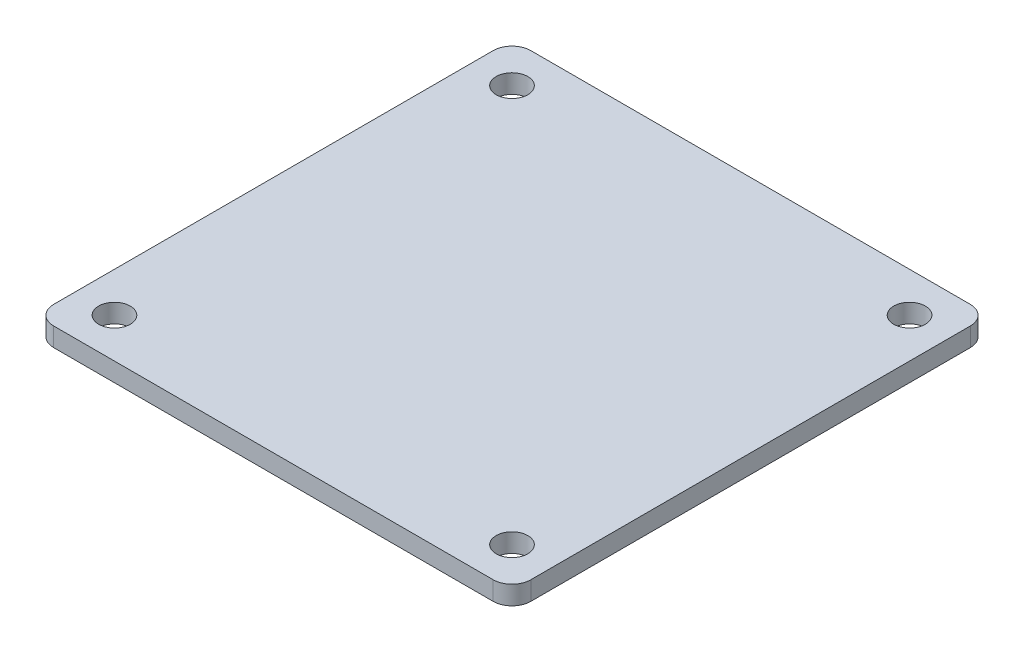
ISO-10303-21;
HEADER;
FILE_DESCRIPTION(('STEP AP214'),'2;1');
FILE_NAME('part.step','',(''),(''),'','','');
FILE_SCHEMA(('AUTOMOTIVE_DESIGN { 1 0 10303 214 1 1 1 1 }'));
ENDSEC;
DATA;
#1=APPLICATION_CONTEXT('core data for automotive mechanical design processes');
#2=APPLICATION_PROTOCOL_DEFINITION('international standard','automotive_design',2000,#1);
#3=PRODUCT_CONTEXT('',#1,'mechanical');
#4=PRODUCT('Part','Part','',(#3));
#5=PRODUCT_RELATED_PRODUCT_CATEGORY('part','',(#4));
#6=PRODUCT_DEFINITION_FORMATION('','',#4);
#7=PRODUCT_DEFINITION_CONTEXT('part definition',#1,'design');
#8=PRODUCT_DEFINITION('design','',#6,#7);
#9=PRODUCT_DEFINITION_SHAPE('','',#8);
#10=(LENGTH_UNIT() NAMED_UNIT(*) SI_UNIT(.MILLI.,.METRE.));
#11=(NAMED_UNIT(*) PLANE_ANGLE_UNIT() SI_UNIT($,.RADIAN.));
#12=(NAMED_UNIT(*) SI_UNIT($,.STERADIAN.) SOLID_ANGLE_UNIT());
#13=UNCERTAINTY_MEASURE_WITH_UNIT(LENGTH_MEASURE(1.E-05),#10,'distance_accuracy_value','');
#14=(GEOMETRIC_REPRESENTATION_CONTEXT(3) GLOBAL_UNCERTAINTY_ASSIGNED_CONTEXT((#13)) GLOBAL_UNIT_ASSIGNED_CONTEXT((#10,
#11,#12)) REPRESENTATION_CONTEXT('',''));
#15=CARTESIAN_POINT('',(0.,0.,0.));
#16=DIRECTION('',(0.,0.,1.));
#17=DIRECTION('',(1.,0.,0.));
#18=AXIS2_PLACEMENT_3D('',#15,#16,#17);
#19=CARTESIAN_POINT('',(0.,3.,0.));
#20=DIRECTION('',(0.,-1.,0.));
#21=DIRECTION('',(0.,0.,-1.));
#22=AXIS2_PLACEMENT_3D('',#19,#20,#21);
#23=PLANE('',#22);
#24=DIRECTION('',(1.,0.,0.));
#25=VECTOR('',#24,1.);
#26=CARTESIAN_POINT('',(-38.1,3.,38.1));
#27=LINE('',#26,#25);
#28=CARTESIAN_POINT('',(-35.1,3.,38.1));
#29=VERTEX_POINT('',#28);
#30=CARTESIAN_POINT('',(35.1,3.,38.1));
#31=VERTEX_POINT('',#30);
#32=EDGE_CURVE('E145',#29,#31,#27,.T.);
#33=ORIENTED_EDGE('',*,*,#32,.T.);
#34=CARTESIAN_POINT('',(35.1,3.,35.1));
#35=DIRECTION('',(0.,-1.,0.));
#36=DIRECTION('',(0.,0.,-1.));
#37=AXIS2_PLACEMENT_3D('',#34,#35,#36);
#38=CIRCLE('',#37,3.);
#39=CARTESIAN_POINT('',(38.1,3.,35.1));
#40=VERTEX_POINT('',#39);
#41=EDGE_CURVE('E164',#31,#40,#38,.F.);
#42=ORIENTED_EDGE('',*,*,#41,.T.);
#43=DIRECTION('',(0.,0.,-1.));
#44=VECTOR('',#43,1.);
#45=CARTESIAN_POINT('',(38.1,3.,38.1));
#46=LINE('',#45,#44);
#47=CARTESIAN_POINT('',(38.1,3.,-35.1));
#48=VERTEX_POINT('',#47);
#49=EDGE_CURVE('E128',#40,#48,#46,.T.);
#50=ORIENTED_EDGE('',*,*,#49,.T.);
#51=CARTESIAN_POINT('',(35.1,3.,-35.1));
#52=DIRECTION('',(0.,-1.,0.));
#53=DIRECTION('',(0.,0.,-1.));
#54=AXIS2_PLACEMENT_3D('',#51,#52,#53);
#55=CIRCLE('',#54,3.);
#56=CARTESIAN_POINT('',(35.1,3.,-38.1));
#57=VERTEX_POINT('',#56);
#58=EDGE_CURVE('E162',#48,#57,#55,.F.);
#59=ORIENTED_EDGE('',*,*,#58,.T.);
#60=DIRECTION('',(-1.,0.,0.));
#61=VECTOR('',#60,1.);
#62=CARTESIAN_POINT('',(-38.1,3.,-38.1));
#63=LINE('',#62,#61);
#64=CARTESIAN_POINT('',(-35.1,3.,-38.1));
#65=VERTEX_POINT('',#64);
#66=EDGE_CURVE('E175',#57,#65,#63,.T.);
#67=ORIENTED_EDGE('',*,*,#66,.T.);
#68=CARTESIAN_POINT('',(-35.1,3.,-35.1));
#69=DIRECTION('',(0.,-1.,0.));
#70=DIRECTION('',(0.,0.,-1.));
#71=AXIS2_PLACEMENT_3D('',#68,#69,#70);
#72=CIRCLE('',#71,3.);
#73=CARTESIAN_POINT('',(-38.1,3.,-35.1));
#74=VERTEX_POINT('',#73);
#75=EDGE_CURVE('E63',#65,#74,#72,.F.);
#76=ORIENTED_EDGE('',*,*,#75,.T.);
#77=DIRECTION('',(0.,0.,1.));
#78=VECTOR('',#77,1.);
#79=CARTESIAN_POINT('',(-38.1,3.,38.1));
#80=LINE('',#79,#78);
#81=CARTESIAN_POINT('',(-38.1,3.,35.1));
#82=VERTEX_POINT('',#81);
#83=EDGE_CURVE('E183',#74,#82,#80,.T.);
#84=ORIENTED_EDGE('',*,*,#83,.T.);
#85=CARTESIAN_POINT('',(-35.1,3.,35.1));
#86=DIRECTION('',(0.,-1.,0.));
#87=DIRECTION('',(0.,0.,-1.));
#88=AXIS2_PLACEMENT_3D('',#85,#86,#87);
#89=CIRCLE('',#88,3.);
#90=EDGE_CURVE('E159',#82,#29,#89,.F.);
#91=ORIENTED_EDGE('',*,*,#90,.T.);
#92=EDGE_LOOP('',(#33,#42,#50,#59,#67,#76,#84,#91));
#93=FACE_BOUND('',#92,.T.);
#94=CARTESIAN_POINT('',(-31.75,3.,-31.75));
#95=DIRECTION('',(0.,1.,0.));
#96=DIRECTION('',(0.,0.,1.));
#97=AXIS2_PLACEMENT_3D('',#94,#95,#96);
#98=CIRCLE('',#97,2.525);
#99=CARTESIAN_POINT('',(-31.75,3.,-29.225));
#100=VERTEX_POINT('',#99);
#101=EDGE_CURVE('E136',#100,#100,#98,.T.);
#102=ORIENTED_EDGE('',*,*,#101,.F.);
#103=EDGE_LOOP('',(#102));
#104=FACE_BOUND('',#103,.T.);
#105=CARTESIAN_POINT('',(31.75,3.,-31.75));
#106=DIRECTION('',(0.,1.,0.));
#107=DIRECTION('',(0.,0.,1.));
#108=AXIS2_PLACEMENT_3D('',#105,#106,#107);
#109=CIRCLE('',#108,2.52500000000001);
#110=CARTESIAN_POINT('',(31.75,3.,-29.225));
#111=VERTEX_POINT('',#110);
#112=EDGE_CURVE('E190',#111,#111,#109,.T.);
#113=ORIENTED_EDGE('',*,*,#112,.F.);
#114=EDGE_LOOP('',(#113));
#115=FACE_BOUND('',#114,.T.);
#116=CARTESIAN_POINT('',(31.75,3.,31.75));
#117=DIRECTION('',(0.,1.,0.));
#118=DIRECTION('',(0.,0.,1.));
#119=AXIS2_PLACEMENT_3D('',#116,#117,#118);
#120=CIRCLE('',#119,2.525);
#121=CARTESIAN_POINT('',(31.75,3.,34.275));
#122=VERTEX_POINT('',#121);
#123=EDGE_CURVE('E195',#122,#122,#120,.T.);
#124=ORIENTED_EDGE('',*,*,#123,.F.);
#125=EDGE_LOOP('',(#124));
#126=FACE_BOUND('',#125,.T.);
#127=CARTESIAN_POINT('',(-31.75,3.,31.75));
#128=DIRECTION('',(0.,1.,0.));
#129=DIRECTION('',(0.,0.,1.));
#130=AXIS2_PLACEMENT_3D('',#127,#128,#129);
#131=CIRCLE('',#130,2.525);
#132=CARTESIAN_POINT('',(-31.75,3.,34.275));
#133=VERTEX_POINT('',#132);
#134=EDGE_CURVE('E201',#133,#133,#131,.T.);
#135=ORIENTED_EDGE('',*,*,#134,.F.);
#136=EDGE_LOOP('',(#135));
#137=FACE_BOUND('',#136,.T.);
#138=ADVANCED_FACE('F42',(#93,#104,#115,#126,#137),#23,.F.);
#139=CARTESIAN_POINT('',(0.,0.,0.));
#140=DIRECTION('',(0.,-1.,0.));
#141=DIRECTION('',(0.,0.,-1.));
#142=AXIS2_PLACEMENT_3D('',#139,#140,#141);
#143=PLANE('',#142);
#144=CARTESIAN_POINT('',(31.75,0.,31.75));
#145=DIRECTION('',(0.,1.,0.));
#146=DIRECTION('',(0.,0.,1.));
#147=AXIS2_PLACEMENT_3D('',#144,#145,#146);
#148=CIRCLE('',#147,2.525);
#149=CARTESIAN_POINT('',(31.75,0.,34.275));
#150=VERTEX_POINT('',#149);
#151=EDGE_CURVE('E198',#150,#150,#148,.T.);
#152=ORIENTED_EDGE('',*,*,#151,.T.);
#153=EDGE_LOOP('',(#152));
#154=FACE_BOUND('',#153,.T.);
#155=CARTESIAN_POINT('',(-31.75,0.,-31.75));
#156=DIRECTION('',(0.,1.,0.));
#157=DIRECTION('',(0.,0.,1.));
#158=AXIS2_PLACEMENT_3D('',#155,#156,#157);
#159=CIRCLE('',#158,2.525);
#160=CARTESIAN_POINT('',(-31.75,0.,-29.225));
#161=VERTEX_POINT('',#160);
#162=EDGE_CURVE('E142',#161,#161,#159,.T.);
#163=ORIENTED_EDGE('',*,*,#162,.T.);
#164=EDGE_LOOP('',(#163));
#165=FACE_BOUND('',#164,.T.);
#166=DIRECTION('',(0.,0.,-1.));
#167=VECTOR('',#166,1.);
#168=CARTESIAN_POINT('',(38.1,0.,38.1));
#169=LINE('',#168,#167);
#170=CARTESIAN_POINT('',(38.1,0.,35.1));
#171=VERTEX_POINT('',#170);
#172=CARTESIAN_POINT('',(38.1,0.,-35.1));
#173=VERTEX_POINT('',#172);
#174=EDGE_CURVE('E125',#171,#173,#169,.T.);
#175=ORIENTED_EDGE('',*,*,#174,.F.);
#176=CARTESIAN_POINT('',(35.1,0.,35.1));
#177=DIRECTION('',(0.,-1.,0.));
#178=DIRECTION('',(0.,0.,-1.));
#179=AXIS2_PLACEMENT_3D('',#176,#177,#178);
#180=CIRCLE('',#179,3.);
#181=CARTESIAN_POINT('',(35.1,0.,38.1));
#182=VERTEX_POINT('',#181);
#183=EDGE_CURVE('E108',#171,#182,#180,.T.);
#184=ORIENTED_EDGE('',*,*,#183,.T.);
#185=DIRECTION('',(1.,0.,0.));
#186=VECTOR('',#185,1.);
#187=CARTESIAN_POINT('',(-38.1,0.,38.1));
#188=LINE('',#187,#186);
#189=CARTESIAN_POINT('',(-35.1,0.,38.1));
#190=VERTEX_POINT('',#189);
#191=EDGE_CURVE('E149',#190,#182,#188,.T.);
#192=ORIENTED_EDGE('',*,*,#191,.F.);
#193=CARTESIAN_POINT('',(-35.1,0.,35.1));
#194=DIRECTION('',(0.,-1.,0.));
#195=DIRECTION('',(0.,0.,-1.));
#196=AXIS2_PLACEMENT_3D('',#193,#194,#195);
#197=CIRCLE('',#196,3.);
#198=CARTESIAN_POINT('',(-38.1,0.,35.1));
#199=VERTEX_POINT('',#198);
#200=EDGE_CURVE('E129',#190,#199,#197,.T.);
#201=ORIENTED_EDGE('',*,*,#200,.T.);
#202=DIRECTION('',(0.,0.,1.));
#203=VECTOR('',#202,1.);
#204=CARTESIAN_POINT('',(-38.1,0.,38.1));
#205=LINE('',#204,#203);
#206=CARTESIAN_POINT('',(-38.1,0.,-35.1));
#207=VERTEX_POINT('',#206);
#208=EDGE_CURVE('E139',#207,#199,#205,.T.);
#209=ORIENTED_EDGE('',*,*,#208,.F.);
#210=CARTESIAN_POINT('',(-35.1,0.,-35.1));
#211=DIRECTION('',(0.,-1.,0.));
#212=DIRECTION('',(0.,0.,-1.));
#213=AXIS2_PLACEMENT_3D('',#210,#211,#212);
#214=CIRCLE('',#213,3.);
#215=CARTESIAN_POINT('',(-35.1,0.,-38.1));
#216=VERTEX_POINT('',#215);
#217=EDGE_CURVE('E153',#207,#216,#214,.T.);
#218=ORIENTED_EDGE('',*,*,#217,.T.);
#219=DIRECTION('',(-1.,0.,0.));
#220=VECTOR('',#219,1.);
#221=CARTESIAN_POINT('',(-38.1,0.,-38.1));
#222=LINE('',#221,#220);
#223=CARTESIAN_POINT('',(35.1,0.,-38.1));
#224=VERTEX_POINT('',#223);
#225=EDGE_CURVE('E135',#224,#216,#222,.T.);
#226=ORIENTED_EDGE('',*,*,#225,.F.);
#227=CARTESIAN_POINT('',(35.1,0.,-35.1));
#228=DIRECTION('',(0.,-1.,0.));
#229=DIRECTION('',(0.,0.,-1.));
#230=AXIS2_PLACEMENT_3D('',#227,#228,#229);
#231=CIRCLE('',#230,3.);
#232=EDGE_CURVE('E119',#224,#173,#231,.T.);
#233=ORIENTED_EDGE('',*,*,#232,.T.);
#234=EDGE_LOOP('',(#175,#184,#192,#201,#209,#218,#226,#233));
#235=FACE_BOUND('',#234,.T.);
#236=CARTESIAN_POINT('',(31.75,0.,-31.75));
#237=DIRECTION('',(0.,1.,0.));
#238=DIRECTION('',(0.,0.,1.));
#239=AXIS2_PLACEMENT_3D('',#236,#237,#238);
#240=CIRCLE('',#239,2.52500000000001);
#241=CARTESIAN_POINT('',(31.75,0.,-29.225));
#242=VERTEX_POINT('',#241);
#243=EDGE_CURVE('E192',#242,#242,#240,.T.);
#244=ORIENTED_EDGE('',*,*,#243,.T.);
#245=EDGE_LOOP('',(#244));
#246=FACE_BOUND('',#245,.T.);
#247=CARTESIAN_POINT('',(-31.75,0.,31.75));
#248=DIRECTION('',(0.,1.,0.));
#249=DIRECTION('',(0.,0.,1.));
#250=AXIS2_PLACEMENT_3D('',#247,#248,#249);
#251=CIRCLE('',#250,2.525);
#252=CARTESIAN_POINT('',(-31.75,0.,34.275));
#253=VERTEX_POINT('',#252);
#254=EDGE_CURVE('E204',#253,#253,#251,.T.);
#255=ORIENTED_EDGE('',*,*,#254,.T.);
#256=EDGE_LOOP('',(#255));
#257=FACE_BOUND('',#256,.T.);
#258=ADVANCED_FACE('F132',(#154,#165,#235,#246,#257),#143,.T.);
#259=CARTESIAN_POINT('',(38.1,3.,38.1));
#260=DIRECTION('',(-1.,0.,0.));
#261=DIRECTION('',(0.,0.,1.));
#262=AXIS2_PLACEMENT_3D('',#259,#260,#261);
#263=PLANE('',#262);
#264=ORIENTED_EDGE('',*,*,#49,.F.);
#265=DIRECTION('',(0.,-1.,0.));
#266=VECTOR('',#265,1.);
#267=CARTESIAN_POINT('',(38.1,3.,35.1));
#268=LINE('',#267,#266);
#269=EDGE_CURVE('E112',#40,#171,#268,.T.);
#270=ORIENTED_EDGE('',*,*,#269,.T.);
#271=ORIENTED_EDGE('',*,*,#174,.T.);
#272=DIRECTION('',(0.,-1.,0.));
#273=VECTOR('',#272,1.);
#274=CARTESIAN_POINT('',(38.1,3.,-35.1));
#275=LINE('',#274,#273);
#276=EDGE_CURVE('E130',#173,#48,#275,.F.);
#277=ORIENTED_EDGE('',*,*,#276,.T.);
#278=EDGE_LOOP('',(#264,#270,#271,#277));
#279=FACE_BOUND('',#278,.T.);
#280=ADVANCED_FACE('F124',(#279),#263,.F.);
#281=CARTESIAN_POINT('',(-38.1,3.,-38.1));
#282=DIRECTION('',(0.,0.,1.));
#283=DIRECTION('',(1.,0.,0.));
#284=AXIS2_PLACEMENT_3D('',#281,#282,#283);
#285=PLANE('',#284);
#286=ORIENTED_EDGE('',*,*,#66,.F.);
#287=DIRECTION('',(0.,-1.,0.));
#288=VECTOR('',#287,1.);
#289=CARTESIAN_POINT('',(35.1,3.,-38.1));
#290=LINE('',#289,#288);
#291=EDGE_CURVE('E168',#57,#224,#290,.T.);
#292=ORIENTED_EDGE('',*,*,#291,.T.);
#293=ORIENTED_EDGE('',*,*,#225,.T.);
#294=DIRECTION('',(0.,-1.,0.));
#295=VECTOR('',#294,1.);
#296=CARTESIAN_POINT('',(-35.1,3.,-38.1));
#297=LINE('',#296,#295);
#298=EDGE_CURVE('E166',#216,#65,#297,.F.);
#299=ORIENTED_EDGE('',*,*,#298,.T.);
#300=EDGE_LOOP('',(#286,#292,#293,#299));
#301=FACE_BOUND('',#300,.T.);
#302=ADVANCED_FACE('F173',(#301),#285,.F.);
#303=CARTESIAN_POINT('',(-38.1,3.,38.1));
#304=DIRECTION('',(1.,0.,0.));
#305=DIRECTION('',(0.,0.,-1.));
#306=AXIS2_PLACEMENT_3D('',#303,#304,#305);
#307=PLANE('',#306);
#308=ORIENTED_EDGE('',*,*,#83,.F.);
#309=DIRECTION('',(0.,-1.,0.));
#310=VECTOR('',#309,1.);
#311=CARTESIAN_POINT('',(-38.1,3.,-35.1));
#312=LINE('',#311,#310);
#313=EDGE_CURVE('E11',#74,#207,#312,.T.);
#314=ORIENTED_EDGE('',*,*,#313,.T.);
#315=ORIENTED_EDGE('',*,*,#208,.T.);
#316=DIRECTION('',(0.,-1.,0.));
#317=VECTOR('',#316,1.);
#318=CARTESIAN_POINT('',(-38.1,3.,35.1));
#319=LINE('',#318,#317);
#320=EDGE_CURVE('E50',#199,#82,#319,.F.);
#321=ORIENTED_EDGE('',*,*,#320,.T.);
#322=EDGE_LOOP('',(#308,#314,#315,#321));
#323=FACE_BOUND('',#322,.T.);
#324=ADVANCED_FACE('F182',(#323),#307,.F.);
#325=CARTESIAN_POINT('',(-38.1,3.,38.1));
#326=DIRECTION('',(0.,0.,-1.));
#327=DIRECTION('',(-1.,0.,0.));
#328=AXIS2_PLACEMENT_3D('',#325,#326,#327);
#329=PLANE('',#328);
#330=ORIENTED_EDGE('',*,*,#191,.T.);
#331=DIRECTION('',(0.,-1.,0.));
#332=VECTOR('',#331,1.);
#333=CARTESIAN_POINT('',(35.1,3.,38.1));
#334=LINE('',#333,#332);
#335=EDGE_CURVE('E113',#182,#31,#334,.F.);
#336=ORIENTED_EDGE('',*,*,#335,.T.);
#337=ORIENTED_EDGE('',*,*,#32,.F.);
#338=DIRECTION('',(0.,-1.,0.));
#339=VECTOR('',#338,1.);
#340=CARTESIAN_POINT('',(-35.1,3.,38.1));
#341=LINE('',#340,#339);
#342=EDGE_CURVE('E118',#29,#190,#341,.T.);
#343=ORIENTED_EDGE('',*,*,#342,.T.);
#344=EDGE_LOOP('',(#330,#336,#337,#343));
#345=FACE_BOUND('',#344,.T.);
#346=ADVANCED_FACE('F226',(#345),#329,.F.);
#347=CARTESIAN_POINT('',(-31.75,3.,-31.75));
#348=DIRECTION('',(0.,-1.,0.));
#349=DIRECTION('',(0.,0.,-1.));
#350=AXIS2_PLACEMENT_3D('',#347,#348,#349);
#351=CYLINDRICAL_SURFACE('',#350,2.525);
#352=ORIENTED_EDGE('',*,*,#101,.T.);
#353=EDGE_LOOP('',(#352));
#354=FACE_BOUND('',#353,.T.);
#355=ORIENTED_EDGE('',*,*,#162,.F.);
#356=EDGE_LOOP('',(#355));
#357=FACE_BOUND('',#356,.T.);
#358=ADVANCED_FACE('F223',(#354,#357),#351,.F.);
#359=CARTESIAN_POINT('',(31.75,3.,-31.75));
#360=DIRECTION('',(0.,-1.,0.));
#361=DIRECTION('',(0.,0.,-1.));
#362=AXIS2_PLACEMENT_3D('',#359,#360,#361);
#363=CYLINDRICAL_SURFACE('',#362,2.52500000000001);
#364=ORIENTED_EDGE('',*,*,#112,.T.);
#365=EDGE_LOOP('',(#364));
#366=FACE_BOUND('',#365,.T.);
#367=ORIENTED_EDGE('',*,*,#243,.F.);
#368=EDGE_LOOP('',(#367));
#369=FACE_BOUND('',#368,.T.);
#370=ADVANCED_FACE('F283',(#366,#369),#363,.F.);
#371=CARTESIAN_POINT('',(31.75,3.,31.75));
#372=DIRECTION('',(0.,-1.,0.));
#373=DIRECTION('',(0.,0.,-1.));
#374=AXIS2_PLACEMENT_3D('',#371,#372,#373);
#375=CYLINDRICAL_SURFACE('',#374,2.525);
#376=ORIENTED_EDGE('',*,*,#123,.T.);
#377=EDGE_LOOP('',(#376));
#378=FACE_BOUND('',#377,.T.);
#379=ORIENTED_EDGE('',*,*,#151,.F.);
#380=EDGE_LOOP('',(#379));
#381=FACE_BOUND('',#380,.T.);
#382=ADVANCED_FACE('F274',(#378,#381),#375,.F.);
#383=CARTESIAN_POINT('',(-31.75,3.,31.75));
#384=DIRECTION('',(0.,-1.,0.));
#385=DIRECTION('',(0.,0.,-1.));
#386=AXIS2_PLACEMENT_3D('',#383,#384,#385);
#387=CYLINDRICAL_SURFACE('',#386,2.525);
#388=ORIENTED_EDGE('',*,*,#134,.T.);
#389=EDGE_LOOP('',(#388));
#390=FACE_BOUND('',#389,.T.);
#391=ORIENTED_EDGE('',*,*,#254,.F.);
#392=EDGE_LOOP('',(#391));
#393=FACE_BOUND('',#392,.T.);
#394=ADVANCED_FACE('F210',(#390,#393),#387,.F.);
#395=CARTESIAN_POINT('',(35.1,3.,35.1));
#396=DIRECTION('',(0.,-1.,0.));
#397=DIRECTION('',(0.,0.,-1.));
#398=AXIS2_PLACEMENT_3D('',#395,#396,#397);
#399=CYLINDRICAL_SURFACE('',#398,3.);
#400=ORIENTED_EDGE('',*,*,#41,.F.);
#401=ORIENTED_EDGE('',*,*,#335,.F.);
#402=ORIENTED_EDGE('',*,*,#183,.F.);
#403=ORIENTED_EDGE('',*,*,#269,.F.);
#404=EDGE_LOOP('',(#400,#401,#402,#403));
#405=FACE_BOUND('',#404,.T.);
#406=ADVANCED_FACE('F111',(#405),#399,.T.);
#407=CARTESIAN_POINT('',(35.1,3.,-35.1));
#408=DIRECTION('',(0.,-1.,0.));
#409=DIRECTION('',(0.,0.,-1.));
#410=AXIS2_PLACEMENT_3D('',#407,#408,#409);
#411=CYLINDRICAL_SURFACE('',#410,3.);
#412=ORIENTED_EDGE('',*,*,#58,.F.);
#413=ORIENTED_EDGE('',*,*,#276,.F.);
#414=ORIENTED_EDGE('',*,*,#232,.F.);
#415=ORIENTED_EDGE('',*,*,#291,.F.);
#416=EDGE_LOOP('',(#412,#413,#414,#415));
#417=FACE_BOUND('',#416,.T.);
#418=ADVANCED_FACE('F238',(#417),#411,.T.);
#419=CARTESIAN_POINT('',(-35.1,3.,-35.1));
#420=DIRECTION('',(0.,-1.,0.));
#421=DIRECTION('',(0.,0.,-1.));
#422=AXIS2_PLACEMENT_3D('',#419,#420,#421);
#423=CYLINDRICAL_SURFACE('',#422,3.);
#424=ORIENTED_EDGE('',*,*,#75,.F.);
#425=ORIENTED_EDGE('',*,*,#298,.F.);
#426=ORIENTED_EDGE('',*,*,#217,.F.);
#427=ORIENTED_EDGE('',*,*,#313,.F.);
#428=EDGE_LOOP('',(#424,#425,#426,#427));
#429=FACE_BOUND('',#428,.T.);
#430=ADVANCED_FACE('F181',(#429),#423,.T.);
#431=CARTESIAN_POINT('',(-35.1,3.,35.1));
#432=DIRECTION('',(0.,-1.,0.));
#433=DIRECTION('',(0.,0.,-1.));
#434=AXIS2_PLACEMENT_3D('',#431,#432,#433);
#435=CYLINDRICAL_SURFACE('',#434,3.);
#436=ORIENTED_EDGE('',*,*,#90,.F.);
#437=ORIENTED_EDGE('',*,*,#320,.F.);
#438=ORIENTED_EDGE('',*,*,#200,.F.);
#439=ORIENTED_EDGE('',*,*,#342,.F.);
#440=EDGE_LOOP('',(#436,#437,#438,#439));
#441=FACE_BOUND('',#440,.T.);
#442=ADVANCED_FACE('F44',(#441),#435,.T.);
#443=CLOSED_SHELL('',(#138,#258,#280,#302,#324,#346,#358,#370,#382,#394,#406,#418,#430,#442));
#444=MANIFOLD_SOLID_BREP('B2',#443);
#445=ADVANCED_BREP_SHAPE_REPRESENTATION('',(#18,#444),#14);
#446=SHAPE_DEFINITION_REPRESENTATION(#9,#445);
ENDSEC;
END-ISO-10303-21;
